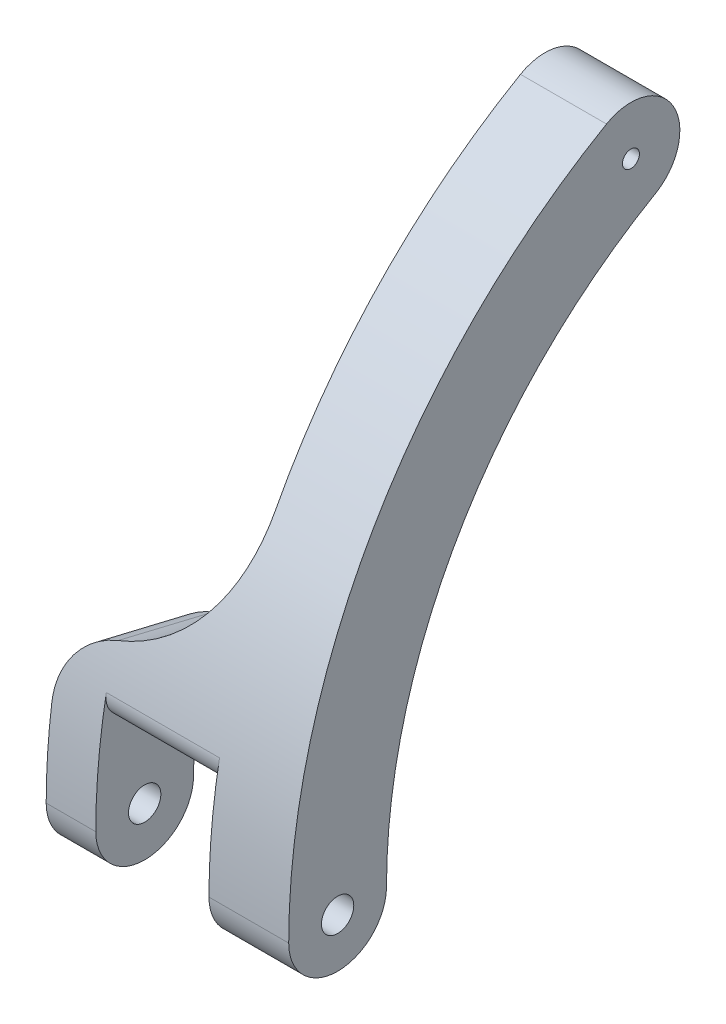
ISO-10303-21;
HEADER;
FILE_DESCRIPTION(('STEP AP214'),'2;1');
FILE_NAME('part.step','',(''),(''),'','','');
FILE_SCHEMA(('AUTOMOTIVE_DESIGN { 1 0 10303 214 1 1 1 1 }'));
ENDSEC;
DATA;
#1=APPLICATION_CONTEXT('core data for automotive mechanical design processes');
#2=APPLICATION_PROTOCOL_DEFINITION('international standard','automotive_design',2000,#1);
#3=PRODUCT_CONTEXT('',#1,'mechanical');
#4=PRODUCT('Part','Part','',(#3));
#5=PRODUCT_RELATED_PRODUCT_CATEGORY('part','',(#4));
#6=PRODUCT_DEFINITION_FORMATION('','',#4);
#7=PRODUCT_DEFINITION_CONTEXT('part definition',#1,'design');
#8=PRODUCT_DEFINITION('design','',#6,#7);
#9=PRODUCT_DEFINITION_SHAPE('','',#8);
#10=(LENGTH_UNIT() NAMED_UNIT(*) SI_UNIT(.MILLI.,.METRE.));
#11=(NAMED_UNIT(*) PLANE_ANGLE_UNIT() SI_UNIT($,.RADIAN.));
#12=(NAMED_UNIT(*) SI_UNIT($,.STERADIAN.) SOLID_ANGLE_UNIT());
#13=UNCERTAINTY_MEASURE_WITH_UNIT(LENGTH_MEASURE(1.E-05),#10,'distance_accuracy_value','');
#14=(GEOMETRIC_REPRESENTATION_CONTEXT(3) GLOBAL_UNCERTAINTY_ASSIGNED_CONTEXT((#13)) GLOBAL_UNIT_ASSIGNED_CONTEXT((#10,
#11,#12)) REPRESENTATION_CONTEXT('',''));
#15=CARTESIAN_POINT('',(0.,0.,0.));
#16=DIRECTION('',(0.,0.,1.));
#17=DIRECTION('',(1.,0.,0.));
#18=AXIS2_PLACEMENT_3D('',#15,#16,#17);
#19=CARTESIAN_POINT('',(5.588,0.,38.1));
#20=DIRECTION('',(-1.,0.,0.));
#21=DIRECTION('',(0.,0.,1.));
#22=AXIS2_PLACEMENT_3D('',#19,#20,#21);
#23=CYLINDRICAL_SURFACE('',#22,3.175);
#24=DIRECTION('',(-1.,0.,0.));
#25=VECTOR('',#24,1.);
#26=CARTESIAN_POINT('',(5.588,0.,34.925));
#27=LINE('',#26,#25);
#28=CARTESIAN_POINT('',(-6.93977999995771,0.,34.925));
#29=VERTEX_POINT('',#28);
#30=CARTESIAN_POINT('',(-10.16,0.,34.925));
#31=VERTEX_POINT('',#30);
#32=EDGE_CURVE('E166',#29,#31,#27,.T.);
#33=ORIENTED_EDGE('',*,*,#32,.F.);
#34=CARTESIAN_POINT('',(-6.93977999995771,0.,38.1));
#35=DIRECTION('',(-1.,0.,0.));
#36=DIRECTION('',(0.,0.,1.));
#37=AXIS2_PLACEMENT_3D('',#34,#35,#36);
#38=CIRCLE('',#37,3.175);
#39=CARTESIAN_POINT('',(-6.93977999995771,0.,41.275));
#40=VERTEX_POINT('',#39);
#41=EDGE_CURVE('E300',#29,#40,#38,.T.);
#42=ORIENTED_EDGE('',*,*,#41,.T.);
#43=DIRECTION('',(-1.,0.,0.));
#44=VECTOR('',#43,1.);
#45=CARTESIAN_POINT('',(5.588,0.,41.275));
#46=LINE('',#45,#44);
#47=CARTESIAN_POINT('',(-10.16,0.,41.275));
#48=VERTEX_POINT('',#47);
#49=EDGE_CURVE('E154',#40,#48,#46,.T.);
#50=ORIENTED_EDGE('',*,*,#49,.T.);
#51=CARTESIAN_POINT('',(-10.16,0.,38.1));
#52=DIRECTION('',(-1.,0.,0.));
#53=DIRECTION('',(0.,0.,1.));
#54=AXIS2_PLACEMENT_3D('',#51,#52,#53);
#55=CIRCLE('',#54,3.175);
#56=EDGE_CURVE('E304',#31,#48,#55,.T.);
#57=ORIENTED_EDGE('',*,*,#56,.F.);
#58=EDGE_LOOP('',(#33,#42,#50,#57));
#59=FACE_BOUND('',#58,.T.);
#60=ADVANCED_FACE('F37',(#59),#23,.T.);
#61=CARTESIAN_POINT('',(0.,0.,19.05));
#62=DIRECTION('',(1.,0.,0.));
#63=DIRECTION('',(0.,0.,-1.));
#64=AXIS2_PLACEMENT_3D('',#61,#62,#63);
#65=PLANE('',#64);
#66=CARTESIAN_POINT('',(0.,32.9955678841871,19.05));
#67=DIRECTION('',(1.,0.,0.));
#68=DIRECTION('',(0.,0.,-1.));
#69=AXIS2_PLACEMENT_3D('',#66,#67,#68);
#70=CIRCLE('',#69,0.55);
#71=CARTESIAN_POINT('',(0.,32.9955678841871,18.5));
#72=VERTEX_POINT('',#71);
#73=EDGE_CURVE('E315',#72,#72,#70,.T.);
#74=ORIENTED_EDGE('',*,*,#73,.T.);
#75=EDGE_LOOP('',(#74));
#76=FACE_BOUND('',#75,.T.);
#77=CARTESIAN_POINT('',(0.,0.,0.));
#78=DIRECTION('',(-1.,0.,0.));
#79=DIRECTION('',(0.,0.,1.));
#80=AXIS2_PLACEMENT_3D('',#77,#78,#79);
#81=CIRCLE('',#80,34.925);
#82=CARTESIAN_POINT('',(0.,17.6762724947282,30.1215042069966));
#83=VERTEX_POINT('',#82);
#84=CARTESIAN_POINT('',(0.,30.2459372271715,17.4625));
#85=VERTEX_POINT('',#84);
#86=EDGE_CURVE('E319',#83,#85,#81,.T.);
#87=ORIENTED_EDGE('',*,*,#86,.F.);
#88=DIRECTION('',(0.,-0.233333333333334,-0.972396809720988));
#89=VECTOR('',#88,1.);
#90=CARTESIAN_POINT('',(0.,19.5103849200986,37.7650116545671));
#91=LINE('',#90,#89);
#92=CARTESIAN_POINT('',(0.,19.2140515867652,36.5300677062215));
#93=VERTEX_POINT('',#92);
#94=EDGE_CURVE('E174',#83,#93,#91,.F.);
#95=ORIENTED_EDGE('',*,*,#94,.T.);
#96=CARTESIAN_POINT('',(0.,0.,0.));
#97=DIRECTION('',(1.,0.,0.));
#98=DIRECTION('',(0.,0.,1.));
#99=AXIS2_PLACEMENT_3D('',#96,#97,#98);
#100=CIRCLE('',#99,41.275);
#101=CARTESIAN_POINT('',(0.,35.7451985412027,20.6375));
#102=VERTEX_POINT('',#101);
#103=EDGE_CURVE('E161',#102,#93,#100,.T.);
#104=ORIENTED_EDGE('',*,*,#103,.F.);
#105=CARTESIAN_POINT('',(0.,32.9955678841871,19.05));
#106=DIRECTION('',(1.,0.,0.));
#107=DIRECTION('',(0.,0.,-1.));
#108=AXIS2_PLACEMENT_3D('',#105,#106,#107);
#109=CIRCLE('',#108,3.175);
#110=EDGE_CURVE('E328',#85,#102,#109,.T.);
#111=ORIENTED_EDGE('',*,*,#110,.F.);
#112=EDGE_LOOP('',(#87,#95,#104,#111));
#113=FACE_BOUND('',#112,.T.);
#114=ADVANCED_FACE('F230',(#76,#113),#65,.F.);
#115=CARTESIAN_POINT('',(5.588,0.,19.05));
#116=DIRECTION('',(1.,0.,0.));
#117=DIRECTION('',(0.,0.,-1.));
#118=AXIS2_PLACEMENT_3D('',#115,#116,#117);
#119=PLANE('',#118);
#120=CARTESIAN_POINT('',(5.588,32.9955678841871,19.05));
#121=DIRECTION('',(1.,0.,0.));
#122=DIRECTION('',(0.,0.,-1.));
#123=AXIS2_PLACEMENT_3D('',#120,#121,#122);
#124=CIRCLE('',#123,0.55);
#125=CARTESIAN_POINT('',(5.588,32.9955678841871,18.5));
#126=VERTEX_POINT('',#125);
#127=EDGE_CURVE('E316',#126,#126,#124,.T.);
#128=ORIENTED_EDGE('',*,*,#127,.F.);
#129=EDGE_LOOP('',(#128));
#130=FACE_BOUND('',#129,.T.);
#131=CARTESIAN_POINT('',(5.588,0.,38.1));
#132=DIRECTION('',(1.,0.,0.));
#133=DIRECTION('',(0.,0.,-1.));
#134=AXIS2_PLACEMENT_3D('',#131,#132,#133);
#135=CIRCLE('',#134,3.175);
#136=CARTESIAN_POINT('',(5.588,0.,41.275));
#137=VERTEX_POINT('',#136);
#138=CARTESIAN_POINT('',(5.588,0.,34.925));
#139=VERTEX_POINT('',#138);
#140=EDGE_CURVE('E152',#137,#139,#135,.T.);
#141=ORIENTED_EDGE('',*,*,#140,.T.);
#142=CARTESIAN_POINT('',(5.588,0.,0.));
#143=DIRECTION('',(-1.,0.,0.));
#144=DIRECTION('',(0.,0.,1.));
#145=AXIS2_PLACEMENT_3D('',#142,#143,#144);
#146=CIRCLE('',#145,34.925);
#147=CARTESIAN_POINT('',(5.588,30.2459372271715,17.4625));
#148=VERTEX_POINT('',#147);
#149=EDGE_CURVE('E323',#139,#148,#146,.T.);
#150=ORIENTED_EDGE('',*,*,#149,.T.);
#151=CARTESIAN_POINT('',(5.588,32.9955678841871,19.05));
#152=DIRECTION('',(1.,0.,0.));
#153=DIRECTION('',(0.,0.,-1.));
#154=AXIS2_PLACEMENT_3D('',#151,#152,#153);
#155=CIRCLE('',#154,3.175);
#156=CARTESIAN_POINT('',(5.588,35.7451985412027,20.6375));
#157=VERTEX_POINT('',#156);
#158=EDGE_CURVE('E325',#148,#157,#155,.T.);
#159=ORIENTED_EDGE('',*,*,#158,.T.);
#160=CARTESIAN_POINT('',(5.588,0.,0.));
#161=DIRECTION('',(1.,0.,0.));
#162=DIRECTION('',(0.,0.,1.));
#163=AXIS2_PLACEMENT_3D('',#160,#161,#162);
#164=CIRCLE('',#163,41.275);
#165=EDGE_CURVE('E159',#157,#137,#164,.T.);
#166=ORIENTED_EDGE('',*,*,#165,.T.);
#167=EDGE_LOOP('',(#141,#150,#159,#166));
#168=FACE_BOUND('',#167,.T.);
#169=CARTESIAN_POINT('',(5.588,0.,38.1));
#170=DIRECTION('',(1.,0.,0.));
#171=DIRECTION('',(0.,0.,-1.));
#172=AXIS2_PLACEMENT_3D('',#169,#170,#171);
#173=CIRCLE('',#172,1.05);
#174=CARTESIAN_POINT('',(5.588,0.,37.05));
#175=VERTEX_POINT('',#174);
#176=EDGE_CURVE('E312',#175,#175,#173,.T.);
#177=ORIENTED_EDGE('',*,*,#176,.F.);
#178=EDGE_LOOP('',(#177));
#179=FACE_BOUND('',#178,.T.);
#180=ADVANCED_FACE('F243',(#130,#168,#179),#119,.T.);
#181=CARTESIAN_POINT('',(0.410219000042295,0.,41.275));
#182=VERTEX_POINT('',#181);
#183=EDGE_CURVE('E143',#137,#182,#46,.T.);
#184=ORIENTED_EDGE('',*,*,#183,.T.);
#185=CARTESIAN_POINT('',(0.410219000042295,0.,38.1));
#186=DIRECTION('',(1.,0.,0.));
#187=DIRECTION('',(0.,0.,-1.));
#188=AXIS2_PLACEMENT_3D('',#185,#186,#187);
#189=CIRCLE('',#188,3.175);
#190=CARTESIAN_POINT('',(0.410219000042295,0.,34.925));
#191=VERTEX_POINT('',#190);
#192=EDGE_CURVE('E130',#182,#191,#189,.T.);
#193=ORIENTED_EDGE('',*,*,#192,.T.);
#194=EDGE_CURVE('E167',#139,#191,#27,.T.);
#195=ORIENTED_EDGE('',*,*,#194,.F.);
#196=ORIENTED_EDGE('',*,*,#140,.F.);
#197=EDGE_LOOP('',(#184,#193,#195,#196));
#198=FACE_BOUND('',#197,.T.);
#199=ADVANCED_FACE('F150',(#198),#23,.T.);
#200=CARTESIAN_POINT('',(5.588,0.,0.));
#201=DIRECTION('',(-1.,0.,0.));
#202=DIRECTION('',(0.,0.,1.));
#203=AXIS2_PLACEMENT_3D('',#200,#201,#202);
#204=CYLINDRICAL_SURFACE('',#203,34.925);
#205=CARTESIAN_POINT('',(0.410219000042295,0.,0.));
#206=DIRECTION('',(1.,0.,0.));
#207=DIRECTION('',(0.,0.,-1.));
#208=AXIS2_PLACEMENT_3D('',#205,#206,#207);
#209=CIRCLE('',#208,34.925);
#210=CARTESIAN_POINT('',(0.410219000042295,6.9178826355525,34.2330034446398));
#211=VERTEX_POINT('',#210);
#212=EDGE_CURVE('E52',#191,#211,#209,.F.);
#213=ORIENTED_EDGE('',*,*,#212,.T.);
#214=DIRECTION('',(-1.,0.,0.));
#215=VECTOR('',#214,1.);
#216=CARTESIAN_POINT('',(5.588,6.9178826355525,34.2330034446398));
#217=LINE('',#216,#215);
#218=CARTESIAN_POINT('',(-6.93977999995771,6.9178826355525,34.2330034446398));
#219=VERTEX_POINT('',#218);
#220=EDGE_CURVE('E356',#211,#219,#217,.T.);
#221=ORIENTED_EDGE('',*,*,#220,.T.);
#222=CARTESIAN_POINT('',(-6.93977999995771,0.,0.));
#223=DIRECTION('',(-1.,0.,0.));
#224=DIRECTION('',(0.,0.,1.));
#225=AXIS2_PLACEMENT_3D('',#222,#223,#224);
#226=CIRCLE('',#225,34.925);
#227=EDGE_CURVE('E59',#219,#29,#226,.F.);
#228=ORIENTED_EDGE('',*,*,#227,.T.);
#229=ORIENTED_EDGE('',*,*,#32,.T.);
#230=CARTESIAN_POINT('',(-10.16,0.,0.));
#231=DIRECTION('',(1.,0.,0.));
#232=DIRECTION('',(0.,0.,1.));
#233=AXIS2_PLACEMENT_3D('',#230,#231,#232);
#234=CIRCLE('',#233,34.925);
#235=CARTESIAN_POINT('',(-10.16,3.99754359096242,34.6954646926418));
#236=VERTEX_POINT('',#235);
#237=EDGE_CURVE('E310',#236,#31,#234,.T.);
#238=ORIENTED_EDGE('',*,*,#237,.F.);
#239=CARTESIAN_POINT('',(-10.16,3.99754359096242,34.6954646926418));
#240=CARTESIAN_POINT('',(-10.1600158920012,4.13885498119989,34.6791917372385));
#241=CARTESIAN_POINT('',(-10.1541128748646,4.28006668224528,34.6620384593496));
#242=CARTESIAN_POINT('',(-10.1305289633513,4.56130002185477,34.6261476534643));
#243=CARTESIAN_POINT('',(-10.1128480667332,4.70132166019241,34.6074101251665));
#244=CARTESIAN_POINT('',(-10.065782710729,4.97909930459957,34.5685390905696));
#245=CARTESIAN_POINT('',(-10.0364054041083,5.11685664185563,34.548406443638));
#246=CARTESIAN_POINT('',(-9.96612271538044,5.38921424189323,34.5069697017915));
#247=CARTESIAN_POINT('',(-9.92521767049743,5.52381459690208,34.4856656411589));
#248=CARTESIAN_POINT('',(-9.8321167061104,5.78897357821488,34.4421467694604));
#249=CARTESIAN_POINT('',(-9.77991548954973,5.91953027540223,34.4199315350967));
#250=CARTESIAN_POINT('',(-9.66456299289956,6.17566551861892,34.3748992206233));
#251=CARTESIAN_POINT('',(-9.60140762711427,6.30124218564016,34.3520819186554));
#252=CARTESIAN_POINT('',(-9.46463712667629,6.54641854483708,34.3062031877791));
#253=CARTESIAN_POINT('',(-9.39102809652889,6.6660216706005,34.2831419085663));
#254=CARTESIAN_POINT('',(-9.23381163942923,6.89854751661322,34.2371103003245));
#255=CARTESIAN_POINT('',(-9.15020065321157,7.01146783724566,34.2141400066954));
#256=CARTESIAN_POINT('',(-8.97383756773981,7.22951216599626,34.1687305723128));
#257=CARTESIAN_POINT('',(-8.88111139055905,7.33465687334584,34.1462901382119));
#258=CARTESIAN_POINT('',(-8.68698106418329,7.53679305627025,34.1022444760457));
#259=CARTESIAN_POINT('',(-8.58557684852785,7.63378446939209,34.0806392543786));
#260=CARTESIAN_POINT('',(-8.3748159655807,7.8189644734244,34.0386315146891));
#261=CARTESIAN_POINT('',(-8.26546048735074,7.90715437588512,34.0182288176593));
#262=CARTESIAN_POINT('',(-8.03960146261698,8.07414760193565,33.9789805890124));
#263=CARTESIAN_POINT('',(-7.92309935760277,8.15295280906768,33.9601347451625));
#264=CARTESIAN_POINT('',(-7.64174318800546,8.3265971530452,33.9180476932811));
#265=CARTESIAN_POINT('',(-7.47423931722799,8.41739232146707,33.8955772195793));
#266=CARTESIAN_POINT('',(-7.21611852255808,8.53918694251228,33.8650211201199));
#267=CARTESIAN_POINT('',(-7.12899088031119,8.57736602121305,33.8553657588263));
#268=CARTESIAN_POINT('',(-6.95266063358209,8.64887125454498,33.8371689058104));
#269=CARTESIAN_POINT('',(-6.86345818964934,8.68219778323021,33.8286273282386));
#270=CARTESIAN_POINT('',(-6.77333333333333,8.71305975948823,33.8206773236076));
#271=B_SPLINE_CURVE_WITH_KNOTS('',3,(#239,#240,#241,#242,#243,#244,#245,#246,#247,#248,#249,
#250,#251,#252,#253,#254,#255,#256,#257,#258,#259,#260,#261,#262,#263,#264,#265,#266,#267,#268,
#269,#270),.UNSPECIFIED.,.F.,.F.,(4,2,2,2,2,2,2,2,2,2,2,2,2,2,2,4),(0.,0.426613221532057,
0.853226524247934,1.27957933768224,1.70591968019677,2.13246037923853,2.559160513562,
2.98561248958461,3.41221667548124,3.83764096004695,4.26306850300047,4.68843255624812,
5.11371109299802,5.6878610900966,5.97457669882349,6.26127019464454),.UNSPECIFIED.);
#272=CARTESIAN_POINT('',(-6.77333333333333,8.71305975948823,33.8206773236076));
#273=VERTEX_POINT('',#272);
#274=EDGE_CURVE('E209',#236,#273,#271,.T.);
#275=ORIENTED_EDGE('',*,*,#274,.T.);
#276=CARTESIAN_POINT('',(-10.16,8.14916666666666,33.9609585795055));
#277=CARTESIAN_POINT('',(-9.8744787164192,8.14913074250583,33.9609401169632));
#278=CARTESIAN_POINT('',(-9.58896181275759,8.16086878729864,33.9581497241446));
#279=CARTESIAN_POINT('',(-9.01996641918665,8.20763339537859,33.9468915940758));
#280=CARTESIAN_POINT('',(-8.73648783932396,8.24265892450922,33.9384241089351));
#281=CARTESIAN_POINT('',(-8.17374394355279,8.33571086364678,33.9156852385036));
#282=CARTESIAN_POINT('',(-7.8944761737167,8.3937232937119,33.9014173806883));
#283=CARTESIAN_POINT('',(-7.34196269938055,8.53224087410182,33.8668217657958));
#284=CARTESIAN_POINT('',(-7.06871692101519,8.61274574837011,33.8464940830925));
#285=CARTESIAN_POINT('',(-6.53004075830979,8.79561321469573,33.7994336450215));
#286=CARTESIAN_POINT('',(-6.26461467563224,8.89798759093148,33.7726974355268));
#287=CARTESIAN_POINT('',(-5.74362783186431,9.12369119399187,33.7124238416275));
#288=CARTESIAN_POINT('',(-5.48806701949402,9.24702031187528,33.678886492581));
#289=CARTESIAN_POINT('',(-4.98867939547986,9.51355648890571,33.6045680717151));
#290=CARTESIAN_POINT('',(-4.74485084209727,9.65676058513062,33.5637880793616));
#291=CARTESIAN_POINT('',(-4.27064820832324,9.96182474560734,33.4745114935163));
#292=CARTESIAN_POINT('',(-4.04027400226133,10.1236846355625,33.4260149721165));
#293=CARTESIAN_POINT('',(-3.59543449809168,10.4640532354809,33.3210265341076));
#294=CARTESIAN_POINT('',(-3.38091612415829,10.6425014221146,33.2645633218627));
#295=CARTESIAN_POINT('',(-2.96844985359172,11.0149668869851,33.1430911047276));
#296=CARTESIAN_POINT('',(-2.7705019902029,11.2089841964557,33.0780820826932));
#297=CARTESIAN_POINT('',(-2.39263035004355,11.6108456118466,32.9391722340851));
#298=CARTESIAN_POINT('',(-2.21270428349473,11.8186879556142,32.8652725397582));
#299=CARTESIAN_POINT('',(-1.87212979160298,12.2463595355625,32.7083196239312));
#300=CARTESIAN_POINT('',(-1.71148087916267,12.4661884686603,32.6252666338194));
#301=CARTESIAN_POINT('',(-1.41273194847415,12.9126099718048,32.451143087462));
#302=CARTESIAN_POINT('',(-1.27433976511506,13.1390589961967,32.3602056554476));
#303=CARTESIAN_POINT('',(-1.01819866921693,13.5997125460943,32.1693270904954));
#304=CARTESIAN_POINT('',(-0.900450465155856,13.8339173374412,32.0693856487282));
#305=CARTESIAN_POINT('',(-0.686243175157494,14.308076753273,31.8606594677482));
#306=CARTESIAN_POINT('',(-0.589784961689572,14.5480316129507,31.7518743663696));
#307=CARTESIAN_POINT('',(-0.418599318775266,15.0315609159281,31.5258484576173));
#308=CARTESIAN_POINT('',(-0.343868033193048,15.275134708857,31.4086091553263));
#309=CARTESIAN_POINT('',(-0.186186553345814,15.8795317331349,31.108792569104));
#310=CARTESIAN_POINT('',(-0.115992287578461,16.2414570853265,30.9214848500214));
#311=CARTESIAN_POINT('',(-0.0461837081623307,16.7821117434762,30.6293725840205));
#312=CARTESIAN_POINT('',(-0.0288277578783942,16.9618377508405,30.5302137264539));
#313=CARTESIAN_POINT('',(-0.0057371983763098,17.3200931076292,30.328406999088));
#314=CARTESIAN_POINT('',(-3.45665064941914E-06,17.4986223667359,30.2257588694276));
#315=CARTESIAN_POINT('',(0.,17.6762724947282,30.1215042069966));
#316=B_SPLINE_CURVE_WITH_KNOTS('',3,(#276,#277,#278,#279,#280,#281,#282,#283,#284,#285,#286,
#287,#288,#289,#290,#291,#292,#293,#294,#295,#296,#297,#298,#299,#300,#301,#302,#303,#304,#305,
#306,#307,#308,#309,#310,#311,#312,#313,#314,#315),.UNSPECIFIED.,.F.,.F.,(4,2,2,2,2,2,2,2,2,2,2,
2,2,2,2,2,2,2,2,4),(0.,0.856302873515154,1.71256772265544,2.56831261458496,3.42404700416257,
4.28024366664199,5.13643587799182,5.99250058674414,6.84855729813553,7.7016048300399,
8.55465407331841,9.40759479367634,10.2605139572877,11.1011142743867,11.9417434342916,
12.7824070370052,13.622921345959,14.8599738610412,15.4776707925462,16.0954138278288),.UNSPECIFIED.);
#317=EDGE_CURVE('E176',#273,#83,#316,.T.);
#318=ORIENTED_EDGE('',*,*,#317,.T.);
#319=ORIENTED_EDGE('',*,*,#86,.T.);
#320=DIRECTION('',(-1.,0.,0.));
#321=VECTOR('',#320,1.);
#322=CARTESIAN_POINT('',(5.588,30.2459372271715,17.4625));
#323=LINE('',#322,#321);
#324=EDGE_CURVE('E157',#148,#85,#323,.T.);
#325=ORIENTED_EDGE('',*,*,#324,.F.);
#326=ORIENTED_EDGE('',*,*,#149,.F.);
#327=ORIENTED_EDGE('',*,*,#194,.T.);
#328=EDGE_LOOP('',(#213,#221,#228,#229,#238,#275,#318,#319,#325,#326,#327));
#329=FACE_BOUND('',#328,.T.);
#330=ADVANCED_FACE('F191',(#329),#204,.F.);
#331=CARTESIAN_POINT('',(5.588,32.9955678841871,19.05));
#332=DIRECTION('',(-1.,0.,0.));
#333=DIRECTION('',(0.,0.,1.));
#334=AXIS2_PLACEMENT_3D('',#331,#332,#333);
#335=CYLINDRICAL_SURFACE('',#334,3.175);
#336=ORIENTED_EDGE('',*,*,#110,.T.);
#337=DIRECTION('',(-1.,0.,0.));
#338=VECTOR('',#337,1.);
#339=CARTESIAN_POINT('',(5.588,35.7451985412027,20.6375));
#340=LINE('',#339,#338);
#341=EDGE_CURVE('E153',#157,#102,#340,.T.);
#342=ORIENTED_EDGE('',*,*,#341,.F.);
#343=ORIENTED_EDGE('',*,*,#158,.F.);
#344=ORIENTED_EDGE('',*,*,#324,.T.);
#345=EDGE_LOOP('',(#336,#342,#343,#344));
#346=FACE_BOUND('',#345,.T.);
#347=ADVANCED_FACE('F229',(#346),#335,.T.);
#348=CARTESIAN_POINT('',(5.588,0.,0.));
#349=DIRECTION('',(-1.,0.,0.));
#350=DIRECTION('',(0.,0.,1.));
#351=AXIS2_PLACEMENT_3D('',#348,#349,#350);
#352=CYLINDRICAL_SURFACE('',#351,41.275);
#353=CARTESIAN_POINT('',(-6.93977999995771,0.,0.));
#354=DIRECTION('',(-1.,0.,0.));
#355=DIRECTION('',(0.,0.,1.));
#356=AXIS2_PLACEMENT_3D('',#353,#354,#355);
#357=CIRCLE('',#356,41.275);
#358=CARTESIAN_POINT('',(-6.93977999995771,7.48709302325581,40.5902582285592));
#359=VERTEX_POINT('',#358);
#360=EDGE_CURVE('E169',#40,#359,#357,.T.);
#361=ORIENTED_EDGE('',*,*,#360,.T.);
#362=DIRECTION('',(-1.,0.,0.));
#363=VECTOR('',#362,1.);
#364=CARTESIAN_POINT('',(5.588,7.48709302325581,40.5902582285592));
#365=LINE('',#364,#363);
#366=CARTESIAN_POINT('',(0.410219000042295,7.48709302325581,40.5902582285592));
#367=VERTEX_POINT('',#366);
#368=EDGE_CURVE('E146',#359,#367,#365,.F.);
#369=ORIENTED_EDGE('',*,*,#368,.T.);
#370=CARTESIAN_POINT('',(0.410219000042295,0.,0.));
#371=DIRECTION('',(1.,0.,0.));
#372=DIRECTION('',(0.,0.,-1.));
#373=AXIS2_PLACEMENT_3D('',#370,#371,#372);
#374=CIRCLE('',#373,41.275);
#375=EDGE_CURVE('E133',#367,#182,#374,.T.);
#376=ORIENTED_EDGE('',*,*,#375,.T.);
#377=ORIENTED_EDGE('',*,*,#183,.F.);
#378=ORIENTED_EDGE('',*,*,#165,.F.);
#379=ORIENTED_EDGE('',*,*,#341,.T.);
#380=ORIENTED_EDGE('',*,*,#103,.T.);
#381=CARTESIAN_POINT('',(0.,19.2140515867652,36.5300677062215));
#382=CARTESIAN_POINT('',(3.22823221909652E-05,18.9618798525141,36.6627364424697));
#383=CARTESIAN_POINT('',(-0.0112594205781719,18.7082883856274,36.7927557484809));
#384=CARTESIAN_POINT('',(-0.0566295254980792,18.2000836812528,37.0467632857071));
#385=CARTESIAN_POINT('',(-0.090711166068218,17.945470303659,37.1707506570709));
#386=CARTESIAN_POINT('',(-0.181786135202866,17.4371893755784,37.4118873623154));
#387=CARTESIAN_POINT('',(-0.238772505037976,17.1835215614209,37.5290387606779));
#388=CARTESIAN_POINT('',(-0.375534292255928,16.6790548041071,37.755942622711));
#389=CARTESIAN_POINT('',(-0.455308051731302,16.42825565362,37.865695623938));
#390=CARTESIAN_POINT('',(-0.63745756315719,15.9311713715222,38.0775067237087));
#391=CARTESIAN_POINT('',(-0.739866620241927,15.6848934768076,38.1795531830228));
#392=CARTESIAN_POINT('',(-0.966664132792206,15.1992989590586,38.3754542142025));
#393=CARTESIAN_POINT('',(-1.09105240540883,14.9599822781321,38.4693088542076));
#394=CARTESIAN_POINT('',(-1.36097293082575,14.4904589761056,38.6486139000617));
#395=CARTESIAN_POINT('',(-1.50649513721305,14.2602480921857,38.7340682669523));
#396=CARTESIAN_POINT('',(-1.81775001585237,13.8107961613706,38.8965891727209));
#397=CARTESIAN_POINT('',(-1.98348228454982,13.5915548955573,38.9736558790257));
#398=CARTESIAN_POINT('',(-2.33126968574488,13.1692349910832,39.1183580302882));
#399=CARTESIAN_POINT('',(-2.51303084208602,12.9659580013551,39.1861215230143));
#400=CARTESIAN_POINT('',(-2.8937561400662,12.5735416216022,39.3137922285926));
#401=CARTESIAN_POINT('',(-3.09272019856907,12.3844021632635,39.3736994794082));
#402=CARTESIAN_POINT('',(-3.50652405948016,12.0217627215304,39.4859328789148));
#403=CARTESIAN_POINT('',(-3.72136870590578,11.848267546196,39.5382566999211));
#404=CARTESIAN_POINT('',(-4.16537444649852,11.5184011217272,39.6356108029676));
#405=CARTESIAN_POINT('',(-4.39453548152971,11.3620298018676,39.6806411151319));
#406=CARTESIAN_POINT('',(-4.86709612573559,11.0667310401505,39.7640137598962));
#407=CARTESIAN_POINT('',(-5.11057794552273,10.9279224537467,39.8023111425361));
#408=CARTESIAN_POINT('',(-5.60871232548811,10.6700704318661,39.872209272269));
#409=CARTESIAN_POINT('',(-5.86336508527999,10.5510273497613,39.9038098996387));
#410=CARTESIAN_POINT('',(-6.38197857857369,10.3337180332051,39.9606371984033));
#411=CARTESIAN_POINT('',(-6.64593595214808,10.2354443867234,39.985866144302));
#412=CARTESIAN_POINT('',(-7.18128627837475,10.0604430529438,40.0302538132094));
#413=CARTESIAN_POINT('',(-7.452677806307,9.98371126852259,40.0494136906049));
#414=CARTESIAN_POINT('',(-8.12473564978707,9.82282529064545,40.0892454746554));
#415=CARTESIAN_POINT('',(-8.52862061496445,9.75086824545531,40.1067181628048));
#416=CARTESIAN_POINT('',(-9.13839762342183,9.67887914695674,40.1241252596725));
#417=CARTESIAN_POINT('',(-9.3422346995406,9.66087388237673,40.1284606589486));
#418=CARTESIAN_POINT('',(-9.75069353923172,9.63685088245325,40.1342350276704));
#419=CARTESIAN_POINT('',(-9.95531544325871,9.63083540373637,40.13567345187));
#420=CARTESIAN_POINT('',(-10.16,9.63083333333332,40.1356783212338));
#421=B_SPLINE_CURVE_WITH_KNOTS('',3,(#381,#382,#383,#384,#385,#386,#387,#388,#389,#390,#391,
#392,#393,#394,#395,#396,#397,#398,#399,#400,#401,#402,#403,#404,#405,#406,#407,#408,#409,#410,
#411,#412,#413,#414,#415,#416,#417,#418,#419,#420),.UNSPECIFIED.,.F.,.F.,(4,2,2,2,2,2,2,2,2,2,2,
2,2,2,2,2,2,2,2,4),(0.,0.854618633555974,1.70935873800261,2.56383935828036,3.41825782623796,
4.27394193840116,5.12961893231458,5.98489048748481,6.8401449673867,7.68209700879637,
8.52404498154658,9.36625083995614,10.2084532197409,11.0560807504832,11.9037234336642,
12.7510631041803,13.5982415068013,14.8266370776005,15.4403568164012,16.0541920539745),.UNSPECIFIED.);
#422=CARTESIAN_POINT('',(-6.77333333333333,10.194899972788,39.9961203061603));
#423=VERTEX_POINT('',#422);
#424=EDGE_CURVE('E184',#93,#423,#421,.T.);
#425=ORIENTED_EDGE('',*,*,#424,.T.);
#426=CARTESIAN_POINT('',(-6.77333333333333,10.194899972788,39.9961203061603));
#427=CARTESIAN_POINT('',(-6.90790872545265,10.1488049494999,40.0078662970568));
#428=CARTESIAN_POINT('',(-7.04046698008907,10.0971692898029,40.020946700988));
#429=CARTESIAN_POINT('',(-7.30063068723195,9.98321112494829,40.0495273979611));
#430=CARTESIAN_POINT('',(-7.42823633576353,9.92088904329152,40.0650275951048));
#431=CARTESIAN_POINT('',(-7.67752737294944,9.78598107596325,40.0981919642807));
#432=CARTESIAN_POINT('',(-7.79921556904834,9.71340012258776,40.1158550958674));
#433=CARTESIAN_POINT('',(-8.03587345385695,9.55843323730592,40.1530612974245));
#434=CARTESIAN_POINT('',(-8.15084324290974,9.47604745189592,40.1726043393059));
#435=CARTESIAN_POINT('',(-8.3732815927991,9.30198722966361,40.2132645276545));
#436=CARTESIAN_POINT('',(-8.480747908336,9.21031003247639,40.2343821414123));
#437=CARTESIAN_POINT('',(-8.68741219190555,9.01826542566732,40.2778624973241));
#438=CARTESIAN_POINT('',(-8.78660726908681,8.91789500248681,40.3002256702919));
#439=CARTESIAN_POINT('',(-8.975940927308,8.70920989574683,40.3458385418638));
#440=CARTESIAN_POINT('',(-9.06608315745075,8.600898443834,40.3690878780096));
#441=CARTESIAN_POINT('',(-9.23671393078191,8.37703303621948,40.4161356635561));
#442=CARTESIAN_POINT('',(-9.31720250215914,8.26147910166743,40.4399341113532));
#443=CARTESIAN_POINT('',(-9.46782366733993,8.02412870235319,40.4876970075001));
#444=CARTESIAN_POINT('',(-9.53797392121668,7.90234337320629,40.511661097809));
#445=CARTESIAN_POINT('',(-9.66756830004651,7.65323568258737,40.5594586689844));
#446=CARTESIAN_POINT('',(-9.72701611710582,7.52591524949533,40.5832921921319));
#447=CARTESIAN_POINT('',(-9.83482397888291,7.26658068656659,40.6305278395217));
#448=CARTESIAN_POINT('',(-9.88318401030236,7.13456655110064,40.6539299632466));
#449=CARTESIAN_POINT('',(-9.96847721095532,6.86683071337757,40.7000089373019));
#450=CARTESIAN_POINT('',(-10.005413096825,6.73110990092718,40.7226859589081));
#451=CARTESIAN_POINT('',(-10.0775961537897,6.41291597952497,40.7741791313447));
#452=CARTESIAN_POINT('',(-10.1085230212889,6.2293762738189,40.8026384434435));
#453=CARTESIAN_POINT('',(-10.1394207564497,5.95235979812782,40.8436503508649));
#454=CARTESIAN_POINT('',(-10.1471379130511,5.85979710040566,40.8570333353981));
#455=CARTESIAN_POINT('',(-10.1574268576681,5.67431059723715,40.8832068136172));
#456=CARTESIAN_POINT('',(-10.1599990816056,5.58138682305273,40.89599735741));
#457=CARTESIAN_POINT('',(-10.16,5.48839772342974,40.90847241623));
#458=B_SPLINE_CURVE_WITH_KNOTS('',3,(#426,#427,#428,#429,#430,#431,#432,#433,#434,#435,#436,
#437,#438,#439,#440,#441,#442,#443,#444,#445,#446,#447,#448,#449,#450,#451,#452,#453,#454,#455,
#456,#457),.UNSPECIFIED.,.F.,.F.,(4,2,2,2,2,2,2,2,2,2,2,2,2,2,2,4),(0.,0.428074530320939,
0.856132100053383,1.28398456243098,1.71183063296459,2.13980418602104,2.56792669705334,
2.99587593807256,3.42382392944358,3.85103220240772,4.27809281428409,4.70515393836078,
5.13211343004229,5.6956608472192,5.9770695954845,6.25845449943388),.UNSPECIFIED.);
#459=CARTESIAN_POINT('',(-10.16,5.48839772342974,40.90847241623));
#460=VERTEX_POINT('',#459);
#461=EDGE_CURVE('E216',#423,#460,#458,.T.);
#462=ORIENTED_EDGE('',*,*,#461,.T.);
#463=CARTESIAN_POINT('',(-10.16,0.,0.));
#464=DIRECTION('',(-1.,0.,0.));
#465=DIRECTION('',(0.,0.,1.));
#466=AXIS2_PLACEMENT_3D('',#463,#464,#465);
#467=CIRCLE('',#466,41.275);
#468=EDGE_CURVE('E307',#48,#460,#467,.T.);
#469=ORIENTED_EDGE('',*,*,#468,.F.);
#470=ORIENTED_EDGE('',*,*,#49,.F.);
#471=EDGE_LOOP('',(#361,#369,#376,#377,#378,#379,#380,#425,#462,#469,#470));
#472=FACE_BOUND('',#471,.T.);
#473=ADVANCED_FACE('F141',(#472),#352,.T.);
#474=CARTESIAN_POINT('',(5.588,32.9955678841871,19.05));
#475=DIRECTION('',(-1.,0.,0.));
#476=DIRECTION('',(0.,0.,1.));
#477=AXIS2_PLACEMENT_3D('',#474,#475,#476);
#478=CYLINDRICAL_SURFACE('',#477,0.55);
#479=ORIENTED_EDGE('',*,*,#127,.T.);
#480=EDGE_LOOP('',(#479));
#481=FACE_BOUND('',#480,.T.);
#482=ORIENTED_EDGE('',*,*,#73,.F.);
#483=EDGE_LOOP('',(#482));
#484=FACE_BOUND('',#483,.T.);
#485=ADVANCED_FACE('F228',(#481,#484),#478,.F.);
#486=CARTESIAN_POINT('',(5.588,0.,38.1));
#487=DIRECTION('',(-1.,0.,0.));
#488=DIRECTION('',(0.,0.,1.));
#489=AXIS2_PLACEMENT_3D('',#486,#487,#488);
#490=CYLINDRICAL_SURFACE('',#489,1.05);
#491=CARTESIAN_POINT('',(0.410219000042295,0.,38.1));
#492=DIRECTION('',(1.,0.,0.));
#493=DIRECTION('',(0.,0.,-1.));
#494=AXIS2_PLACEMENT_3D('',#491,#492,#493);
#495=CIRCLE('',#494,1.05);
#496=CARTESIAN_POINT('',(0.410219000042295,0.,37.05));
#497=VERTEX_POINT('',#496);
#498=EDGE_CURVE('E148',#497,#497,#495,.T.);
#499=ORIENTED_EDGE('',*,*,#498,.F.);
#500=EDGE_LOOP('',(#499));
#501=FACE_BOUND('',#500,.T.);
#502=ORIENTED_EDGE('',*,*,#176,.T.);
#503=EDGE_LOOP('',(#502));
#504=FACE_BOUND('',#503,.T.);
#505=ADVANCED_FACE('F258',(#501,#504),#490,.F.);
#506=CARTESIAN_POINT('',(-10.16,0.,38.1));
#507=DIRECTION('',(-1.,0.,0.));
#508=DIRECTION('',(0.,0.,1.));
#509=AXIS2_PLACEMENT_3D('',#506,#507,#508);
#510=PLANE('',#509);
#511=CARTESIAN_POINT('',(-10.16,-3.51466647443392E-06,38.1000026465475));
#512=DIRECTION('',(-1.,0.,0.));
#513=DIRECTION('',(0.,0.,1.));
#514=AXIS2_PLACEMENT_3D('',#511,#512,#513);
#515=CIRCLE('',#514,1.05);
#516=CARTESIAN_POINT('',(-10.16,-3.51466647443392E-06,39.1500026465474));
#517=VERTEX_POINT('',#516);
#518=EDGE_CURVE('E287',#517,#517,#515,.T.);
#519=ORIENTED_EDGE('',*,*,#518,.F.);
#520=EDGE_LOOP('',(#519));
#521=FACE_BOUND('',#520,.T.);
#522=ORIENTED_EDGE('',*,*,#468,.T.);
#523=DIRECTION('',(0.,-0.233333333333334,-0.972396809720988));
#524=VECTOR('',#523,1.);
#525=CARTESIAN_POINT('',(-10.16,4.05692240926387,34.9429208647047));
#526=LINE('',#525,#524);
#527=EDGE_CURVE('E340',#460,#236,#526,.T.);
#528=ORIENTED_EDGE('',*,*,#527,.T.);
#529=ORIENTED_EDGE('',*,*,#237,.T.);
#530=ORIENTED_EDGE('',*,*,#56,.T.);
#531=EDGE_LOOP('',(#522,#528,#529,#530));
#532=FACE_BOUND('',#531,.T.);
#533=ADVANCED_FACE('F262',(#521,#532),#510,.T.);
#534=CARTESIAN_POINT('',(-6.93977999995771,-5.715,43.2861291884024));
#535=DIRECTION('',(-1.,0.,0.));
#536=DIRECTION('',(0.,0.,1.));
#537=AXIS2_PLACEMENT_3D('',#534,#535,#536);
#538=PLANE('',#537);
#539=CARTESIAN_POINT('',(-6.93977999995771,-3.51466647443392E-06,38.1000026465475));
#540=DIRECTION('',(-1.,0.,0.));
#541=DIRECTION('',(0.,0.,1.));
#542=AXIS2_PLACEMENT_3D('',#539,#540,#541);
#543=CIRCLE('',#542,1.05);
#544=CARTESIAN_POINT('',(-6.93977999995771,-3.51466647443392E-06,39.1500026465474));
#545=VERTEX_POINT('',#544);
#546=EDGE_CURVE('E290',#545,#545,#543,.T.);
#547=ORIENTED_EDGE('',*,*,#546,.T.);
#548=EDGE_LOOP('',(#547));
#549=FACE_BOUND('',#548,.T.);
#550=ORIENTED_EDGE('',*,*,#227,.F.);
#551=CARTESIAN_POINT('',(-6.93977999995771,7.215,35.7032827622335));
#552=DIRECTION('',(-1.,0.,0.));
#553=DIRECTION('',(0.,0.,1.));
#554=AXIS2_PLACEMENT_3D('',#551,#552,#553);
#555=CIRCLE('',#554,1.5);
#556=CARTESIAN_POINT('',(-6.93977999995771,5.715,35.7032827622335));
#557=VERTEX_POINT('',#556);
#558=EDGE_CURVE('E11',#219,#557,#555,.T.);
#559=ORIENTED_EDGE('',*,*,#558,.T.);
#560=DIRECTION('',(0.,0.,1.));
#561=VECTOR('',#560,1.);
#562=CARTESIAN_POINT('',(-6.93977999995771,5.715,43.2861291884024));
#563=LINE('',#562,#561);
#564=CARTESIAN_POINT('',(-6.93977999995771,5.715,39.1151428477514));
#565=VERTEX_POINT('',#564);
#566=EDGE_CURVE('E292',#557,#565,#563,.T.);
#567=ORIENTED_EDGE('',*,*,#566,.T.);
#568=CARTESIAN_POINT('',(-6.93977999995771,7.215,39.1151428477514));
#569=DIRECTION('',(-1.,0.,0.));
#570=DIRECTION('',(0.,0.,1.));
#571=AXIS2_PLACEMENT_3D('',#568,#569,#570);
#572=CIRCLE('',#571,1.5);
#573=EDGE_CURVE('E351',#565,#359,#572,.T.);
#574=ORIENTED_EDGE('',*,*,#573,.T.);
#575=ORIENTED_EDGE('',*,*,#360,.F.);
#576=ORIENTED_EDGE('',*,*,#41,.F.);
#577=EDGE_LOOP('',(#550,#559,#567,#574,#575,#576));
#578=FACE_BOUND('',#577,.T.);
#579=ADVANCED_FACE('F266',(#549,#578),#538,.F.);
#580=CARTESIAN_POINT('',(0.,5.715,0.));
#581=DIRECTION('',(0.,-1.,0.));
#582=DIRECTION('',(0.,0.,-1.));
#583=AXIS2_PLACEMENT_3D('',#580,#581,#582);
#584=PLANE('',#583);
#585=DIRECTION('',(0.,0.,-1.));
#586=VECTOR('',#585,1.);
#587=CARTESIAN_POINT('',(0.410219000042295,5.715,43.2861291884024));
#588=LINE('',#587,#586);
#589=CARTESIAN_POINT('',(0.410219000042295,5.715,39.1151428477514));
#590=VERTEX_POINT('',#589);
#591=CARTESIAN_POINT('',(0.410219000042295,5.715,35.7032827622335));
#592=VERTEX_POINT('',#591);
#593=EDGE_CURVE('E172',#590,#592,#588,.T.);
#594=ORIENTED_EDGE('',*,*,#593,.F.);
#595=DIRECTION('',(1.,0.,0.));
#596=VECTOR('',#595,1.);
#597=CARTESIAN_POINT('',(-6.93977999995771,5.715,39.1151428477514));
#598=LINE('',#597,#596);
#599=EDGE_CURVE('E358',#590,#565,#598,.F.);
#600=ORIENTED_EDGE('',*,*,#599,.T.);
#601=ORIENTED_EDGE('',*,*,#566,.F.);
#602=DIRECTION('',(1.,0.,0.));
#603=VECTOR('',#602,1.);
#604=CARTESIAN_POINT('',(0.410219000042295,5.715,35.7032827622335));
#605=LINE('',#604,#603);
#606=EDGE_CURVE('E222',#557,#592,#605,.T.);
#607=ORIENTED_EDGE('',*,*,#606,.T.);
#608=EDGE_LOOP('',(#594,#600,#601,#607));
#609=FACE_BOUND('',#608,.T.);
#610=ADVANCED_FACE('F270',(#609),#584,.T.);
#611=CARTESIAN_POINT('',(0.410219000042295,-5.715,43.2861291884024));
#612=DIRECTION('',(1.,0.,0.));
#613=DIRECTION('',(0.,0.,-1.));
#614=AXIS2_PLACEMENT_3D('',#611,#612,#613);
#615=PLANE('',#614);
#616=ORIENTED_EDGE('',*,*,#498,.T.);
#617=EDGE_LOOP('',(#616));
#618=FACE_BOUND('',#617,.T.);
#619=ORIENTED_EDGE('',*,*,#192,.F.);
#620=ORIENTED_EDGE('',*,*,#375,.F.);
#621=CARTESIAN_POINT('',(0.410219000042295,7.215,39.1151428477514));
#622=DIRECTION('',(1.,0.,0.));
#623=DIRECTION('',(0.,0.,-1.));
#624=AXIS2_PLACEMENT_3D('',#621,#622,#623);
#625=CIRCLE('',#624,1.5);
#626=EDGE_CURVE('E355',#367,#590,#625,.T.);
#627=ORIENTED_EDGE('',*,*,#626,.T.);
#628=ORIENTED_EDGE('',*,*,#593,.T.);
#629=CARTESIAN_POINT('',(0.410219000042295,7.215,35.7032827622335));
#630=DIRECTION('',(1.,0.,0.));
#631=DIRECTION('',(0.,0.,-1.));
#632=AXIS2_PLACEMENT_3D('',#629,#630,#631);
#633=CIRCLE('',#632,1.5);
#634=EDGE_CURVE('E45',#592,#211,#633,.T.);
#635=ORIENTED_EDGE('',*,*,#634,.T.);
#636=ORIENTED_EDGE('',*,*,#212,.F.);
#637=EDGE_LOOP('',(#619,#620,#627,#628,#635,#636));
#638=FACE_BOUND('',#637,.T.);
#639=ADVANCED_FACE('F132',(#618,#638),#615,.F.);
#640=CARTESIAN_POINT('',(-10.16,19.5103849200986,37.7650116545671));
#641=DIRECTION('',(0.,0.233333333333334,0.972396809720988));
#642=DIRECTION('',(0.,-0.972396809720988,0.233333333333334));
#643=AXIS2_PLACEMENT_3D('',#640,#641,#642);
#644=CYLINDRICAL_SURFACE('',#643,10.16);
#645=ORIENTED_EDGE('',*,*,#317,.F.);
#646=DIRECTION('',(0.,0.233333333333334,0.972396809720988));
#647=VECTOR('',#646,1.);
#648=CARTESIAN_POINT('',(-6.77333333333333,10.1958543573199,40.0000976224777));
#649=LINE('',#648,#647);
#650=EDGE_CURVE('E223',#273,#423,#649,.T.);
#651=ORIENTED_EDGE('',*,*,#650,.T.);
#652=ORIENTED_EDGE('',*,*,#424,.F.);
#653=ORIENTED_EDGE('',*,*,#94,.F.);
#654=EDGE_LOOP('',(#645,#651,#652,#653));
#655=FACE_BOUND('',#654,.T.);
#656=ADVANCED_FACE('F195',(#655),#644,.F.);
#657=CARTESIAN_POINT('',(-5.08,5.53858907593053,41.1176406064329));
#658=DIRECTION('',(0.,0.233333333333334,0.972396809720988));
#659=DIRECTION('',(0.,-0.972396809720988,0.233333333333334));
#660=AXIS2_PLACEMENT_3D('',#657,#658,#659);
#661=CYLINDRICAL_SURFACE('',#660,5.08);
#662=ORIENTED_EDGE('',*,*,#461,.F.);
#663=ORIENTED_EDGE('',*,*,#650,.F.);
#664=ORIENTED_EDGE('',*,*,#274,.F.);
#665=ORIENTED_EDGE('',*,*,#527,.F.);
#666=EDGE_LOOP('',(#662,#663,#664,#665));
#667=FACE_BOUND('',#666,.T.);
#668=ADVANCED_FACE('F199',(#667),#661,.T.);
#669=CARTESIAN_POINT('',(-10.4469509297162,-3.51466647443392E-06,38.1000026465475));
#670=DIRECTION('',(1.,0.,0.));
#671=DIRECTION('',(0.,0.,-1.));
#672=AXIS2_PLACEMENT_3D('',#669,#670,#671);
#673=CYLINDRICAL_SURFACE('',#672,1.05);
#674=ORIENTED_EDGE('',*,*,#518,.T.);
#675=EDGE_LOOP('',(#674));
#676=FACE_BOUND('',#675,.T.);
#677=ORIENTED_EDGE('',*,*,#546,.F.);
#678=EDGE_LOOP('',(#677));
#679=FACE_BOUND('',#678,.T.);
#680=ADVANCED_FACE('F204',(#676,#679),#673,.F.);
#681=CARTESIAN_POINT('',(5.588,7.215,39.1151428477514));
#682=DIRECTION('',(-1.,0.,0.));
#683=DIRECTION('',(0.,0.,1.));
#684=AXIS2_PLACEMENT_3D('',#681,#682,#683);
#685=CYLINDRICAL_SURFACE('',#684,1.5);
#686=ORIENTED_EDGE('',*,*,#626,.F.);
#687=ORIENTED_EDGE('',*,*,#368,.F.);
#688=ORIENTED_EDGE('',*,*,#573,.F.);
#689=ORIENTED_EDGE('',*,*,#599,.F.);
#690=EDGE_LOOP('',(#686,#687,#688,#689));
#691=FACE_BOUND('',#690,.T.);
#692=ADVANCED_FACE('F206',(#691),#685,.T.);
#693=CARTESIAN_POINT('',(5.588,7.215,35.7032827622335));
#694=DIRECTION('',(-1.,0.,0.));
#695=DIRECTION('',(0.,0.,1.));
#696=AXIS2_PLACEMENT_3D('',#693,#694,#695);
#697=CYLINDRICAL_SURFACE('',#696,1.5);
#698=ORIENTED_EDGE('',*,*,#558,.F.);
#699=ORIENTED_EDGE('',*,*,#220,.F.);
#700=ORIENTED_EDGE('',*,*,#634,.F.);
#701=ORIENTED_EDGE('',*,*,#606,.F.);
#702=EDGE_LOOP('',(#698,#699,#700,#701));
#703=FACE_BOUND('',#702,.T.);
#704=ADVANCED_FACE('F39',(#703),#697,.T.);
#705=CLOSED_SHELL('',(#60,#114,#180,#199,#330,#347,#473,#485,#505,#533,#579,#610,#639,#656,#668,
#680,#692,#704));
#706=MANIFOLD_SOLID_BREP('B2',#705);
#707=ADVANCED_BREP_SHAPE_REPRESENTATION('',(#18,#706),#14);
#708=SHAPE_DEFINITION_REPRESENTATION(#9,#707);
ENDSEC;
END-ISO-10303-21;
